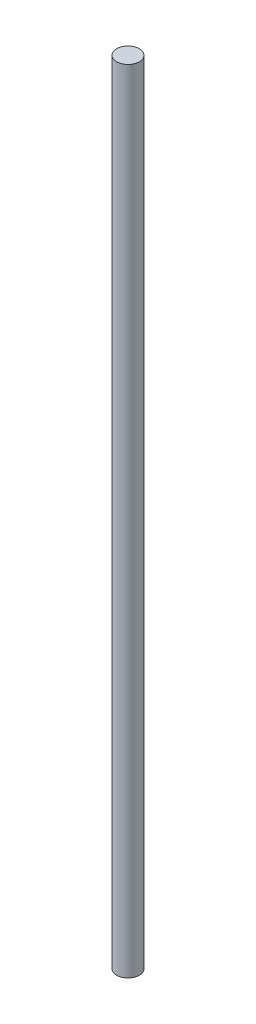
ISO-10303-21;
HEADER;
FILE_DESCRIPTION(('STEP AP214'),'2;1');
FILE_NAME('part.step','',(''),(''),'','','');
FILE_SCHEMA(('AUTOMOTIVE_DESIGN { 1 0 10303 214 1 1 1 1 }'));
ENDSEC;
DATA;
#1=APPLICATION_CONTEXT('core data for automotive mechanical design processes');
#2=APPLICATION_PROTOCOL_DEFINITION('international standard','automotive_design',2000,#1);
#3=PRODUCT_CONTEXT('',#1,'mechanical');
#4=PRODUCT('Part','Part','',(#3));
#5=PRODUCT_RELATED_PRODUCT_CATEGORY('part','',(#4));
#6=PRODUCT_DEFINITION_FORMATION('','',#4);
#7=PRODUCT_DEFINITION_CONTEXT('part definition',#1,'design');
#8=PRODUCT_DEFINITION('design','',#6,#7);
#9=PRODUCT_DEFINITION_SHAPE('','',#8);
#10=(LENGTH_UNIT() NAMED_UNIT(*) SI_UNIT(.MILLI.,.METRE.));
#11=(NAMED_UNIT(*) PLANE_ANGLE_UNIT() SI_UNIT($,.RADIAN.));
#12=(NAMED_UNIT(*) SI_UNIT($,.STERADIAN.) SOLID_ANGLE_UNIT());
#13=UNCERTAINTY_MEASURE_WITH_UNIT(LENGTH_MEASURE(1.E-05),#10,'distance_accuracy_value','');
#14=(GEOMETRIC_REPRESENTATION_CONTEXT(3) GLOBAL_UNCERTAINTY_ASSIGNED_CONTEXT((#13)) GLOBAL_UNIT_ASSIGNED_CONTEXT((#10,
#11,#12)) REPRESENTATION_CONTEXT('',''));
#15=CARTESIAN_POINT('',(0.,0.,0.));
#16=DIRECTION('',(0.,0.,1.));
#17=DIRECTION('',(1.,0.,0.));
#18=AXIS2_PLACEMENT_3D('',#15,#16,#17);
#19=CARTESIAN_POINT('',(0.,420.,0.));
#20=DIRECTION('',(0.,-1.,0.));
#21=DIRECTION('',(0.,0.,-1.));
#22=AXIS2_PLACEMENT_3D('',#19,#20,#21);
#23=CYLINDRICAL_SURFACE('',#22,6.);
#24=CARTESIAN_POINT('',(0.,420.,0.));
#25=DIRECTION('',(0.,1.,0.));
#26=DIRECTION('',(0.,0.,1.));
#27=AXIS2_PLACEMENT_3D('',#24,#25,#26);
#28=CIRCLE('',#27,6.);
#29=CARTESIAN_POINT('',(0.,420.,6.));
#30=VERTEX_POINT('',#29);
#31=EDGE_CURVE('E10',#30,#30,#28,.T.);
#32=ORIENTED_EDGE('',*,*,#31,.F.);
#33=EDGE_LOOP('',(#32));
#34=FACE_BOUND('',#33,.T.);
#35=CARTESIAN_POINT('',(0.,0.,0.));
#36=DIRECTION('',(0.,1.,0.));
#37=DIRECTION('',(0.,0.,1.));
#38=AXIS2_PLACEMENT_3D('',#35,#36,#37);
#39=CIRCLE('',#38,6.);
#40=CARTESIAN_POINT('',(0.,0.,6.));
#41=VERTEX_POINT('',#40);
#42=EDGE_CURVE('E33',#41,#41,#39,.T.);
#43=ORIENTED_EDGE('',*,*,#42,.T.);
#44=EDGE_LOOP('',(#43));
#45=FACE_BOUND('',#44,.T.);
#46=ADVANCED_FACE('F30',(#34,#45),#23,.T.);
#47=CARTESIAN_POINT('',(0.,420.,0.));
#48=DIRECTION('',(0.,1.,0.));
#49=DIRECTION('',(0.,0.,1.));
#50=AXIS2_PLACEMENT_3D('',#47,#48,#49);
#51=PLANE('',#50);
#52=ORIENTED_EDGE('',*,*,#31,.T.);
#53=EDGE_LOOP('',(#52));
#54=FACE_BOUND('',#53,.T.);
#55=ADVANCED_FACE('F45',(#54),#51,.T.);
#56=CARTESIAN_POINT('',(0.,0.,0.));
#57=DIRECTION('',(0.,1.,0.));
#58=DIRECTION('',(0.,0.,1.));
#59=AXIS2_PLACEMENT_3D('',#56,#57,#58);
#60=PLANE('',#59);
#61=ORIENTED_EDGE('',*,*,#42,.F.);
#62=EDGE_LOOP('',(#61));
#63=FACE_BOUND('',#62,.T.);
#64=ADVANCED_FACE('F43',(#63),#60,.F.);
#65=CLOSED_SHELL('',(#46,#55,#64));
#66=MANIFOLD_SOLID_BREP('B2',#65);
#67=ADVANCED_BREP_SHAPE_REPRESENTATION('',(#18,#66),#14);
#68=SHAPE_DEFINITION_REPRESENTATION(#9,#67);
ENDSEC;
END-ISO-10303-21;
